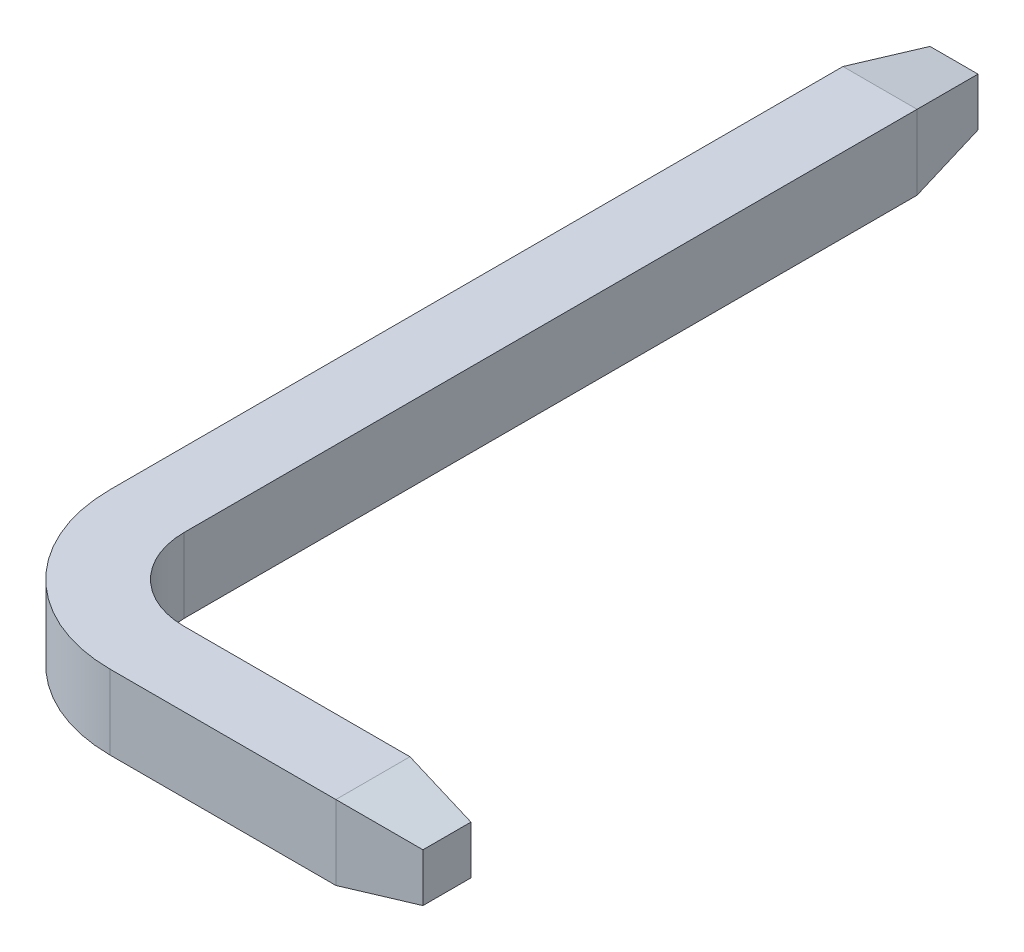
ISO-10303-21;
HEADER;
FILE_DESCRIPTION(('STEP AP214'),'2;1');
FILE_NAME('part.step','',(''),(''),'','','');
FILE_SCHEMA(('AUTOMOTIVE_DESIGN { 1 0 10303 214 1 1 1 1 }'));
ENDSEC;
DATA;
#1=APPLICATION_CONTEXT('core data for automotive mechanical design processes');
#2=APPLICATION_PROTOCOL_DEFINITION('international standard','automotive_design',2000,#1);
#3=PRODUCT_CONTEXT('',#1,'mechanical');
#4=PRODUCT('Part','Part','',(#3));
#5=PRODUCT_RELATED_PRODUCT_CATEGORY('part','',(#4));
#6=PRODUCT_DEFINITION_FORMATION('','',#4);
#7=PRODUCT_DEFINITION_CONTEXT('part definition',#1,'design');
#8=PRODUCT_DEFINITION('design','',#6,#7);
#9=PRODUCT_DEFINITION_SHAPE('','',#8);
#10=(LENGTH_UNIT() NAMED_UNIT(*) SI_UNIT(.MILLI.,.METRE.));
#11=(NAMED_UNIT(*) PLANE_ANGLE_UNIT() SI_UNIT($,.RADIAN.));
#12=(NAMED_UNIT(*) SI_UNIT($,.STERADIAN.) SOLID_ANGLE_UNIT());
#13=UNCERTAINTY_MEASURE_WITH_UNIT(LENGTH_MEASURE(1.E-05),#10,'distance_accuracy_value','');
#14=(GEOMETRIC_REPRESENTATION_CONTEXT(3) GLOBAL_UNCERTAINTY_ASSIGNED_CONTEXT((#13)) GLOBAL_UNIT_ASSIGNED_CONTEXT((#10,
#11,#12)) REPRESENTATION_CONTEXT('',''));
#15=CARTESIAN_POINT('',(0.,0.,0.));
#16=DIRECTION('',(0.,0.,1.));
#17=DIRECTION('',(1.,0.,0.));
#18=AXIS2_PLACEMENT_3D('',#15,#16,#17);
#19=CARTESIAN_POINT('',(2.503962305911,-0.163293740079,-3.516332606812));
#20=DIRECTION('',(-0.173648177667033,0.98480775301219,0.));
#21=DIRECTION('',(-0.98480775301219,-0.173648177667033,0.));
#22=AXIS2_PLACEMENT_3D('',#19,#20,#21);
#23=PLANE('',#22);
#24=DIRECTION('',(0.,0.,1.));
#25=VECTOR('',#24,1.);
#26=CARTESIAN_POINT('',(2.003962305911,-0.251457230434,-3.995294912723));
#27=LINE('',#26,#25);
#28=CARTESIAN_POINT('',(2.00396230591097,-0.251457230434,-2.94506871423417));
#29=VERTEX_POINT('',#28);
#30=CARTESIAN_POINT('',(2.00396230591097,-0.251457230434,-3.44552111121183));
#31=VERTEX_POINT('',#30);
#32=EDGE_CURVE('E135',#29,#31,#27,.F.);
#33=ORIENTED_EDGE('',*,*,#32,.T.);
#34=DIRECTION('',(-0.970287525247556,-0.171087869747438,-0.171087869746095));
#35=VECTOR('',#34,1.);
#36=CARTESIAN_POINT('',(2.503962305911,-0.163293740079,-3.357357620857));
#37=LINE('',#36,#35);
#38=CARTESIAN_POINT('',(2.503962305911,-0.163293740079,-3.357357620857));
#39=VERTEX_POINT('',#38);
#40=EDGE_CURVE('E196',#39,#31,#37,.T.);
#41=ORIENTED_EDGE('',*,*,#40,.F.);
#42=DIRECTION('',(0.,0.,1.));
#43=VECTOR('',#42,1.);
#44=CARTESIAN_POINT('',(2.503962305911,-0.163293740079,-3.516332606812));
#45=LINE('',#44,#43);
#46=CARTESIAN_POINT('',(2.503962305911,-0.163293740079,-3.033232204589));
#47=VERTEX_POINT('',#46);
#48=EDGE_CURVE('E177',#39,#47,#45,.T.);
#49=ORIENTED_EDGE('',*,*,#48,.T.);
#50=DIRECTION('',(0.970287525247556,0.171087869747438,-0.171087869746095));
#51=VECTOR('',#50,1.);
#52=CARTESIAN_POINT('',(2.00396230591088,-0.251457230434,-2.94506871423469));
#53=LINE('',#52,#51);
#54=EDGE_CURVE('E174',#29,#47,#53,.T.);
#55=ORIENTED_EDGE('',*,*,#54,.F.);
#56=EDGE_LOOP('',(#33,#41,#49,#55));
#57=FACE_BOUND('',#56,.T.);
#58=ADVANCED_FACE('F17',(#57),#23,.F.);
#59=CARTESIAN_POINT('',(-0.571263892578,-0.251457230434,-8.945294912723));
#60=DIRECTION('',(0.,-0.98480775301219,-0.173648177667033));
#61=DIRECTION('',(0.,0.173648177667033,-0.98480775301219));
#62=AXIS2_PLACEMENT_3D('',#59,#60,#61);
#63=PLANE('',#62);
#64=DIRECTION('',(-0.171087869746095,-0.171087869747438,0.970287525247556));
#65=VECTOR('',#64,1.);
#66=CARTESIAN_POINT('',(-0.483100402223692,-0.163293740079,-9.44529491272312));
#67=LINE('',#66,#65);
#68=CARTESIAN_POINT('',(-0.483100402223462,-0.163293740079,-9.44529491272308));
#69=VERTEX_POINT('',#68);
#70=CARTESIAN_POINT('',(-0.571263892578,-0.251457230434,-8.945294912723));
#71=VERTEX_POINT('',#70);
#72=EDGE_CURVE('E141',#69,#71,#67,.T.);
#73=ORIENTED_EDGE('',*,*,#72,.F.);
#74=DIRECTION('',(-1.,0.,0.));
#75=VECTOR('',#74,1.);
#76=CARTESIAN_POINT('',(0.,-0.163293740079,-9.445294912723));
#77=LINE('',#76,#75);
#78=CARTESIAN_POINT('',(-0.158974985954501,-0.163293740079,-9.44529491272294));
#79=VERTEX_POINT('',#78);
#80=EDGE_CURVE('E147',#79,#69,#77,.T.);
#81=ORIENTED_EDGE('',*,*,#80,.F.);
#82=DIRECTION('',(-0.171087869746093,0.171087869747508,-0.970287525247544));
#83=VECTOR('',#82,1.);
#84=CARTESIAN_POINT('',(-0.07081149560023,-0.251457230434,-8.945294912723));
#85=LINE('',#84,#83);
#86=CARTESIAN_POINT('',(-0.0708114956002305,-0.251457230434,-8.945294912723));
#87=VERTEX_POINT('',#86);
#88=EDGE_CURVE('E138',#87,#79,#85,.T.);
#89=ORIENTED_EDGE('',*,*,#88,.F.);
#90=DIRECTION('',(1.,0.,0.));
#91=VECTOR('',#90,1.);
#92=CARTESIAN_POINT('',(-0.571263892578,-0.251457230434,-8.945294912723));
#93=LINE('',#92,#91);
#94=EDGE_CURVE('E113',#87,#71,#93,.F.);
#95=ORIENTED_EDGE('',*,*,#94,.T.);
#96=EDGE_LOOP('',(#73,#81,#89,#95));
#97=FACE_BOUND('',#96,.T.);
#98=ADVANCED_FACE('F440',(#97),#63,.T.);
#99=CARTESIAN_POINT('',(2.503962305911,0.,-3.357357620857));
#100=DIRECTION('',(0.173648177667033,0.,-0.98480775301219));
#101=DIRECTION('',(-0.98480775301219,0.,-0.173648177667033));
#102=AXIS2_PLACEMENT_3D('',#99,#100,#101);
#103=PLANE('',#102);
#104=DIRECTION('',(0.970287525247556,-0.171087869746094,0.171087869747438));
#105=VECTOR('',#104,1.);
#106=CARTESIAN_POINT('',(2.00396230591088,0.251457230433308,-3.445521111212));
#107=LINE('',#106,#105);
#108=CARTESIAN_POINT('',(2.00396230591097,0.251457230433827,-3.445521111212));
#109=VERTEX_POINT('',#108);
#110=CARTESIAN_POINT('',(2.503962305911,0.163293740079,-3.357357620857));
#111=VERTEX_POINT('',#110);
#112=EDGE_CURVE('E190',#109,#111,#107,.T.);
#113=ORIENTED_EDGE('',*,*,#112,.T.);
#114=DIRECTION('',(0.,1.,0.));
#115=VECTOR('',#114,1.);
#116=CARTESIAN_POINT('',(2.503962305911,0.,-3.357357620857));
#117=LINE('',#116,#115);
#118=EDGE_CURVE('E193',#111,#39,#117,.F.);
#119=ORIENTED_EDGE('',*,*,#118,.T.);
#120=ORIENTED_EDGE('',*,*,#40,.T.);
#121=DIRECTION('',(0.,1.,0.));
#122=VECTOR('',#121,1.);
#123=CARTESIAN_POINT('',(2.003962305911,-0.251457230434,-3.445521111212));
#124=LINE('',#123,#122);
#125=EDGE_CURVE('E112',#109,#31,#124,.F.);
#126=ORIENTED_EDGE('',*,*,#125,.F.);
#127=EDGE_LOOP('',(#113,#119,#120,#126));
#128=FACE_BOUND('',#127,.T.);
#129=ADVANCED_FACE('F430',(#128),#103,.T.);
#130=CARTESIAN_POINT('',(2.503962305911,0.,-3.516332606812));
#131=DIRECTION('',(-1.,0.,0.));
#132=DIRECTION('',(0.,0.,1.));
#133=AXIS2_PLACEMENT_3D('',#130,#131,#132);
#134=PLANE('',#133);
#135=ORIENTED_EDGE('',*,*,#118,.F.);
#136=DIRECTION('',(0.,0.,1.));
#137=VECTOR('',#136,1.);
#138=CARTESIAN_POINT('',(2.503962305911,0.163293740079,-3.516332606812));
#139=LINE('',#138,#137);
#140=CARTESIAN_POINT('',(2.503962305911,0.163293740079001,-3.033232204589));
#141=VERTEX_POINT('',#140);
#142=EDGE_CURVE('E187',#111,#141,#139,.T.);
#143=ORIENTED_EDGE('',*,*,#142,.T.);
#144=DIRECTION('',(0.,1.,0.));
#145=VECTOR('',#144,1.);
#146=CARTESIAN_POINT('',(2.503962305911,0.,-3.033232204589));
#147=LINE('',#146,#145);
#148=EDGE_CURVE('E176',#47,#141,#147,.T.);
#149=ORIENTED_EDGE('',*,*,#148,.F.);
#150=ORIENTED_EDGE('',*,*,#48,.F.);
#151=EDGE_LOOP('',(#135,#143,#149,#150));
#152=FACE_BOUND('',#151,.T.);
#153=ADVANCED_FACE('F420',(#152),#134,.F.);
#154=CARTESIAN_POINT('',(2.503962305911,0.,-3.033232204589));
#155=DIRECTION('',(0.173648177667033,0.,0.98480775301219));
#156=DIRECTION('',(0.98480775301219,0.,-0.173648177667033));
#157=AXIS2_PLACEMENT_3D('',#154,#155,#156);
#158=PLANE('',#157);
#159=ORIENTED_EDGE('',*,*,#54,.T.);
#160=ORIENTED_EDGE('',*,*,#148,.T.);
#161=DIRECTION('',(-0.970287525247556,0.171087869746095,0.171087869747438));
#162=VECTOR('',#161,1.);
#163=CARTESIAN_POINT('',(2.503962305911,0.163293740079001,-3.033232204589));
#164=LINE('',#163,#162);
#165=CARTESIAN_POINT('',(2.00396230591097,0.251457230433827,-2.945068714234));
#166=VERTEX_POINT('',#165);
#167=EDGE_CURVE('E171',#141,#166,#164,.T.);
#168=ORIENTED_EDGE('',*,*,#167,.T.);
#169=DIRECTION('',(0.,1.,0.));
#170=VECTOR('',#169,1.);
#171=CARTESIAN_POINT('',(2.003962305911,-0.251457230434,-2.945068714234));
#172=LINE('',#171,#170);
#173=EDGE_CURVE('E170',#29,#166,#172,.T.);
#174=ORIENTED_EDGE('',*,*,#173,.F.);
#175=EDGE_LOOP('',(#159,#160,#168,#174));
#176=FACE_BOUND('',#175,.T.);
#177=ADVANCED_FACE('F410',(#176),#158,.T.);
#178=CARTESIAN_POINT('',(0.,0.,-9.445294912723));
#179=DIRECTION('',(0.,0.,-1.));
#180=DIRECTION('',(-1.,0.,0.));
#181=AXIS2_PLACEMENT_3D('',#178,#179,#180);
#182=PLANE('',#181);
#183=DIRECTION('',(1.,0.,0.));
#184=VECTOR('',#183,1.);
#185=CARTESIAN_POINT('',(-0.571263892578,0.163293740079692,-9.44529491272312));
#186=LINE('',#185,#184);
#187=CARTESIAN_POINT('',(-0.158974985954167,0.163293740079462,-9.44529491272305));
#188=VERTEX_POINT('',#187);
#189=CARTESIAN_POINT('',(-0.483100402223231,0.163293740079692,-9.44529491272312));
#190=VERTEX_POINT('',#189);
#191=EDGE_CURVE('E150',#188,#190,#186,.F.);
#192=ORIENTED_EDGE('',*,*,#191,.F.);
#193=DIRECTION('',(0.,1.,0.));
#194=VECTOR('',#193,1.);
#195=CARTESIAN_POINT('',(-0.158974985954501,-0.251457230434,-9.44529491272291));
#196=LINE('',#195,#194);
#197=EDGE_CURVE('E140',#79,#188,#196,.T.);
#198=ORIENTED_EDGE('',*,*,#197,.F.);
#199=ORIENTED_EDGE('',*,*,#80,.T.);
#200=DIRECTION('',(0.,1.,0.));
#201=VECTOR('',#200,1.);
#202=CARTESIAN_POINT('',(-0.483100402223692,-0.251457230434,-9.44529491272312));
#203=LINE('',#202,#201);
#204=EDGE_CURVE('E144',#190,#69,#203,.F.);
#205=ORIENTED_EDGE('',*,*,#204,.F.);
#206=EDGE_LOOP('',(#192,#198,#199,#205));
#207=FACE_BOUND('',#206,.T.);
#208=ADVANCED_FACE('F401',(#207),#182,.T.);
#209=CARTESIAN_POINT('',(-0.571263892578,-0.251457230434,-8.945294912723));
#210=DIRECTION('',(-0.98480775301219,0.,-0.173648177667033));
#211=DIRECTION('',(-0.173648177667033,0.,0.98480775301219));
#212=AXIS2_PLACEMENT_3D('',#209,#210,#211);
#213=PLANE('',#212);
#214=ORIENTED_EDGE('',*,*,#72,.T.);
#215=DIRECTION('',(0.,1.,0.));
#216=VECTOR('',#215,1.);
#217=CARTESIAN_POINT('',(-0.571263892578001,-0.251457230434,-8.945294912723));
#218=LINE('',#217,#216);
#219=CARTESIAN_POINT('',(-0.571263892578,0.251457230434,-8.945294912723));
#220=VERTEX_POINT('',#219);
#221=EDGE_CURVE('E163',#71,#220,#218,.T.);
#222=ORIENTED_EDGE('',*,*,#221,.T.);
#223=DIRECTION('',(-0.171087869747438,0.171087869746095,0.970287525247556));
#224=VECTOR('',#223,1.);
#225=CARTESIAN_POINT('',(-0.483100402223,0.163293740079692,-9.44529491272312));
#226=LINE('',#225,#224);
#227=EDGE_CURVE('E117',#190,#220,#226,.T.);
#228=ORIENTED_EDGE('',*,*,#227,.F.);
#229=ORIENTED_EDGE('',*,*,#204,.T.);
#230=EDGE_LOOP('',(#214,#222,#228,#229));
#231=FACE_BOUND('',#230,.T.);
#232=ADVANCED_FACE('F298',(#231),#213,.T.);
#233=CARTESIAN_POINT('',(-0.07081149560023,-0.251457230434,-8.945294912723));
#234=DIRECTION('',(0.98480775301219,0.,-0.173648177667033));
#235=DIRECTION('',(-0.173648177667033,0.,-0.98480775301219));
#236=AXIS2_PLACEMENT_3D('',#233,#234,#235);
#237=PLANE('',#236);
#238=DIRECTION('',(-0.171087869745121,-0.171087869746165,-0.970287525247952));
#239=VECTOR('',#238,1.);
#240=CARTESIAN_POINT('',(-0.0708114956002297,0.251457230434,-8.945294912723));
#241=LINE('',#240,#239);
#242=CARTESIAN_POINT('',(-0.0708114956002301,0.251457230434,-8.945294912723));
#243=VERTEX_POINT('',#242);
#244=EDGE_CURVE('E152',#243,#188,#241,.T.);
#245=ORIENTED_EDGE('',*,*,#244,.F.);
#246=DIRECTION('',(0.,1.,0.));
#247=VECTOR('',#246,1.);
#248=CARTESIAN_POINT('',(-0.0708114956002307,-0.251457230434,-8.945294912723));
#249=LINE('',#248,#247);
#250=EDGE_CURVE('E34',#243,#87,#249,.F.);
#251=ORIENTED_EDGE('',*,*,#250,.T.);
#252=ORIENTED_EDGE('',*,*,#88,.T.);
#253=ORIENTED_EDGE('',*,*,#197,.T.);
#254=EDGE_LOOP('',(#245,#251,#252,#253));
#255=FACE_BOUND('',#254,.T.);
#256=ADVANCED_FACE('F383',(#255),#237,.T.);
#257=CARTESIAN_POINT('',(-0.571263892578,-0.251457230434,-3.995294912723));
#258=DIRECTION('',(0.,1.,0.));
#259=DIRECTION('',(0.,0.,1.));
#260=AXIS2_PLACEMENT_3D('',#257,#258,#259);
#261=PLANE('',#260);
#262=ORIENTED_EDGE('',*,*,#94,.F.);
#263=DIRECTION('',(0.,0.,1.));
#264=VECTOR('',#263,1.);
#265=CARTESIAN_POINT('',(-0.07081149560023,-0.251457230434,-3.995294912723));
#266=LINE('',#265,#264);
#267=CARTESIAN_POINT('',(-0.07081149560023,-0.251457230434,-3.995294912723));
#268=VERTEX_POINT('',#267);
#269=EDGE_CURVE('E115',#87,#268,#266,.T.);
#270=ORIENTED_EDGE('',*,*,#269,.T.);
#271=CARTESIAN_POINT('',(0.478962305911,-0.251457230434,-3.995294912723));
#272=DIRECTION('',(0.,1.,0.));
#273=DIRECTION('',(0.,0.,1.));
#274=AXIS2_PLACEMENT_3D('',#271,#272,#273);
#275=CIRCLE('',#274,0.549773801511);
#276=CARTESIAN_POINT('',(0.478962305911,-0.251457230434,-3.445521111212));
#277=VERTEX_POINT('',#276);
#278=EDGE_CURVE('E20',#268,#277,#275,.T.);
#279=ORIENTED_EDGE('',*,*,#278,.T.);
#280=DIRECTION('',(-1.,0.,0.));
#281=VECTOR('',#280,1.);
#282=CARTESIAN_POINT('',(0.478962305911,-0.251457230434,-3.445521111212));
#283=LINE('',#282,#281);
#284=EDGE_CURVE('E199',#31,#277,#283,.T.);
#285=ORIENTED_EDGE('',*,*,#284,.F.);
#286=ORIENTED_EDGE('',*,*,#32,.F.);
#287=DIRECTION('',(1.,0.,0.));
#288=VECTOR('',#287,1.);
#289=CARTESIAN_POINT('',(0.478962305911,-0.251457230434,-2.945068714234));
#290=LINE('',#289,#288);
#291=CARTESIAN_POINT('',(0.478962305911,-0.251457230434,-2.945068714234));
#292=VERTEX_POINT('',#291);
#293=EDGE_CURVE('E167',#292,#29,#290,.T.);
#294=ORIENTED_EDGE('',*,*,#293,.F.);
#295=CARTESIAN_POINT('',(0.478962305911,-0.251457230434,-3.995294912723));
#296=DIRECTION('',(0.,1.,0.));
#297=DIRECTION('',(0.,0.,1.));
#298=AXIS2_PLACEMENT_3D('',#295,#296,#297);
#299=CIRCLE('',#298,1.050226198489);
#300=CARTESIAN_POINT('',(-0.571263892578,-0.251457230434,-3.995294912723));
#301=VERTEX_POINT('',#300);
#302=EDGE_CURVE('E218',#301,#292,#299,.T.);
#303=ORIENTED_EDGE('',*,*,#302,.F.);
#304=DIRECTION('',(0.,0.,-1.));
#305=VECTOR('',#304,1.);
#306=CARTESIAN_POINT('',(-0.571263892578,-0.251457230434,-3.995294912723));
#307=LINE('',#306,#305);
#308=EDGE_CURVE('E161',#301,#71,#307,.T.);
#309=ORIENTED_EDGE('',*,*,#308,.T.);
#310=EDGE_LOOP('',(#262,#270,#279,#285,#286,#294,#303,#309));
#311=FACE_BOUND('',#310,.T.);
#312=ADVANCED_FACE('F119',(#311),#261,.F.);
#313=CARTESIAN_POINT('',(0.478962305911,0.,-3.995294912723));
#314=DIRECTION('',(0.,1.,0.));
#315=DIRECTION('',(0.,0.,1.));
#316=AXIS2_PLACEMENT_3D('',#313,#314,#315);
#317=CYLINDRICAL_SURFACE('',#316,0.549773801511);
#318=CARTESIAN_POINT('',(0.478962305911,0.251457230434,-3.995294912723));
#319=DIRECTION('',(0.,1.,0.));
#320=DIRECTION('',(0.,0.,1.));
#321=AXIS2_PLACEMENT_3D('',#318,#319,#320);
#322=CIRCLE('',#321,0.549773801511);
#323=CARTESIAN_POINT('',(-0.07081149560023,0.251457230434,-3.995294912723));
#324=VERTEX_POINT('',#323);
#325=CARTESIAN_POINT('',(0.478962305911,0.251457230434,-3.445521111212));
#326=VERTEX_POINT('',#325);
#327=EDGE_CURVE('E123',#324,#326,#322,.T.);
#328=ORIENTED_EDGE('',*,*,#327,.T.);
#329=DIRECTION('',(0.,1.,0.));
#330=VECTOR('',#329,1.);
#331=CARTESIAN_POINT('',(0.478962305911,-0.251457230434,-3.445521111212));
#332=LINE('',#331,#330);
#333=EDGE_CURVE('E108',#277,#326,#332,.T.);
#334=ORIENTED_EDGE('',*,*,#333,.F.);
#335=ORIENTED_EDGE('',*,*,#278,.F.);
#336=DIRECTION('',(0.,1.,0.));
#337=VECTOR('',#336,1.);
#338=CARTESIAN_POINT('',(-0.07081149560023,-0.251457230434,-3.995294912723));
#339=LINE('',#338,#337);
#340=EDGE_CURVE('E107',#268,#324,#339,.T.);
#341=ORIENTED_EDGE('',*,*,#340,.T.);
#342=EDGE_LOOP('',(#328,#334,#335,#341));
#343=FACE_BOUND('',#342,.T.);
#344=ADVANCED_FACE('F106',(#343),#317,.F.);
#345=CARTESIAN_POINT('',(0.478962305911,-0.251457230434,-3.445521111212));
#346=DIRECTION('',(0.,0.,-1.));
#347=DIRECTION('',(-1.,0.,0.));
#348=AXIS2_PLACEMENT_3D('',#345,#346,#347);
#349=PLANE('',#348);
#350=ORIENTED_EDGE('',*,*,#284,.T.);
#351=ORIENTED_EDGE('',*,*,#333,.T.);
#352=DIRECTION('',(1.,0.,0.));
#353=VECTOR('',#352,1.);
#354=CARTESIAN_POINT('',(-0.571263892578,0.251457230434,-3.445521111212));
#355=LINE('',#354,#353);
#356=EDGE_CURVE('E125',#326,#109,#355,.T.);
#357=ORIENTED_EDGE('',*,*,#356,.T.);
#358=ORIENTED_EDGE('',*,*,#125,.T.);
#359=EDGE_LOOP('',(#350,#351,#357,#358));
#360=FACE_BOUND('',#359,.T.);
#361=ADVANCED_FACE('F249',(#360),#349,.T.);
#362=CARTESIAN_POINT('',(2.503962305911,0.163293740079,-3.516332606812));
#363=DIRECTION('',(-0.173648177667033,-0.98480775301219,0.));
#364=DIRECTION('',(0.98480775301219,-0.173648177667033,0.));
#365=AXIS2_PLACEMENT_3D('',#362,#363,#364);
#366=PLANE('',#365);
#367=ORIENTED_EDGE('',*,*,#142,.F.);
#368=ORIENTED_EDGE('',*,*,#112,.F.);
#369=DIRECTION('',(0.,0.,-1.));
#370=VECTOR('',#369,1.);
#371=CARTESIAN_POINT('',(2.003962305911,0.251457230434,-3.995294912723));
#372=LINE('',#371,#370);
#373=EDGE_CURVE('E233',#109,#166,#372,.F.);
#374=ORIENTED_EDGE('',*,*,#373,.T.);
#375=ORIENTED_EDGE('',*,*,#167,.F.);
#376=EDGE_LOOP('',(#367,#368,#374,#375));
#377=FACE_BOUND('',#376,.T.);
#378=ADVANCED_FACE('F349',(#377),#366,.F.);
#379=CARTESIAN_POINT('',(0.478962305911,-0.251457230434,-2.945068714234));
#380=DIRECTION('',(0.,0.,1.));
#381=DIRECTION('',(1.,0.,0.));
#382=AXIS2_PLACEMENT_3D('',#379,#380,#381);
#383=PLANE('',#382);
#384=DIRECTION('',(1.,0.,0.));
#385=VECTOR('',#384,1.);
#386=CARTESIAN_POINT('',(-0.571263892578,0.251457230434,-2.945068714234));
#387=LINE('',#386,#385);
#388=CARTESIAN_POINT('',(0.478962305911,0.251457230434,-2.945068714234));
#389=VERTEX_POINT('',#388);
#390=EDGE_CURVE('E217',#166,#389,#387,.F.);
#391=ORIENTED_EDGE('',*,*,#390,.T.);
#392=DIRECTION('',(0.,1.,0.));
#393=VECTOR('',#392,1.);
#394=CARTESIAN_POINT('',(0.478962305911,0.,-2.945068714234));
#395=LINE('',#394,#393);
#396=EDGE_CURVE('E219',#292,#389,#395,.T.);
#397=ORIENTED_EDGE('',*,*,#396,.F.);
#398=ORIENTED_EDGE('',*,*,#293,.T.);
#399=ORIENTED_EDGE('',*,*,#173,.T.);
#400=EDGE_LOOP('',(#391,#397,#398,#399));
#401=FACE_BOUND('',#400,.T.);
#402=ADVANCED_FACE('F257',(#401),#383,.T.);
#403=CARTESIAN_POINT('',(0.478962305911,0.,-3.995294912723));
#404=DIRECTION('',(0.,1.,0.));
#405=DIRECTION('',(0.,0.,1.));
#406=AXIS2_PLACEMENT_3D('',#403,#404,#405);
#407=CYLINDRICAL_SURFACE('',#406,1.050226198489);
#408=ORIENTED_EDGE('',*,*,#396,.T.);
#409=CARTESIAN_POINT('',(0.478962305911,0.251457230434,-3.995294912723));
#410=DIRECTION('',(0.,1.,0.));
#411=DIRECTION('',(0.,0.,1.));
#412=AXIS2_PLACEMENT_3D('',#409,#410,#411);
#413=CIRCLE('',#412,1.050226198489);
#414=CARTESIAN_POINT('',(-0.571263892578,0.251457230434,-3.995294912723));
#415=VERTEX_POINT('',#414);
#416=EDGE_CURVE('E214',#389,#415,#413,.F.);
#417=ORIENTED_EDGE('',*,*,#416,.T.);
#418=DIRECTION('',(0.,1.,0.));
#419=VECTOR('',#418,1.);
#420=CARTESIAN_POINT('',(-0.571263892578,-0.251457230434,-3.995294912723));
#421=LINE('',#420,#419);
#422=EDGE_CURVE('E164',#415,#301,#421,.F.);
#423=ORIENTED_EDGE('',*,*,#422,.T.);
#424=ORIENTED_EDGE('',*,*,#302,.T.);
#425=EDGE_LOOP('',(#408,#417,#423,#424));
#426=FACE_BOUND('',#425,.T.);
#427=ADVANCED_FACE('F260',(#426),#407,.T.);
#428=CARTESIAN_POINT('',(-0.571263892578,-0.251457230434,-3.995294912723));
#429=DIRECTION('',(1.,0.,0.));
#430=DIRECTION('',(0.,0.,-1.));
#431=AXIS2_PLACEMENT_3D('',#428,#429,#430);
#432=PLANE('',#431);
#433=ORIENTED_EDGE('',*,*,#221,.F.);
#434=ORIENTED_EDGE('',*,*,#308,.F.);
#435=ORIENTED_EDGE('',*,*,#422,.F.);
#436=DIRECTION('',(0.,0.,-1.));
#437=VECTOR('',#436,1.);
#438=CARTESIAN_POINT('',(-0.571263892578,0.251457230434,-3.995294912723));
#439=LINE('',#438,#437);
#440=EDGE_CURVE('E216',#415,#220,#439,.T.);
#441=ORIENTED_EDGE('',*,*,#440,.T.);
#442=EDGE_LOOP('',(#433,#434,#435,#441));
#443=FACE_BOUND('',#442,.T.);
#444=ADVANCED_FACE('F301',(#443),#432,.F.);
#445=CARTESIAN_POINT('',(-0.571263892578,0.251457230434,-8.945294912723));
#446=DIRECTION('',(0.,0.98480775301219,-0.173648177667033));
#447=DIRECTION('',(0.,0.173648177667033,0.98480775301219));
#448=AXIS2_PLACEMENT_3D('',#445,#446,#447);
#449=PLANE('',#448);
#450=ORIENTED_EDGE('',*,*,#227,.T.);
#451=DIRECTION('',(1.,0.,0.));
#452=VECTOR('',#451,1.);
#453=CARTESIAN_POINT('',(-0.571263892578,0.251457230434,-8.945294912723));
#454=LINE('',#453,#452);
#455=EDGE_CURVE('E26',#220,#243,#454,.T.);
#456=ORIENTED_EDGE('',*,*,#455,.T.);
#457=ORIENTED_EDGE('',*,*,#244,.T.);
#458=ORIENTED_EDGE('',*,*,#191,.T.);
#459=EDGE_LOOP('',(#450,#456,#457,#458));
#460=FACE_BOUND('',#459,.T.);
#461=ADVANCED_FACE('F303',(#460),#449,.T.);
#462=CARTESIAN_POINT('',(-0.07081149560023,-0.251457230434,-3.995294912723));
#463=DIRECTION('',(-1.,0.,0.));
#464=DIRECTION('',(0.,0.,1.));
#465=AXIS2_PLACEMENT_3D('',#462,#463,#464);
#466=PLANE('',#465);
#467=ORIENTED_EDGE('',*,*,#250,.F.);
#468=DIRECTION('',(0.,0.,-1.));
#469=VECTOR('',#468,1.);
#470=CARTESIAN_POINT('',(-0.07081149560023,0.251457230434,-3.995294912723));
#471=LINE('',#470,#469);
#472=EDGE_CURVE('E11',#243,#324,#471,.F.);
#473=ORIENTED_EDGE('',*,*,#472,.T.);
#474=ORIENTED_EDGE('',*,*,#340,.F.);
#475=ORIENTED_EDGE('',*,*,#269,.F.);
#476=EDGE_LOOP('',(#467,#473,#474,#475));
#477=FACE_BOUND('',#476,.T.);
#478=ADVANCED_FACE('F114',(#477),#466,.F.);
#479=CARTESIAN_POINT('',(-0.571263892578,0.251457230434,-3.995294912723));
#480=DIRECTION('',(0.,-1.,0.));
#481=DIRECTION('',(0.,0.,-1.));
#482=AXIS2_PLACEMENT_3D('',#479,#480,#481);
#483=PLANE('',#482);
#484=ORIENTED_EDGE('',*,*,#455,.F.);
#485=ORIENTED_EDGE('',*,*,#440,.F.);
#486=ORIENTED_EDGE('',*,*,#416,.F.);
#487=ORIENTED_EDGE('',*,*,#390,.F.);
#488=ORIENTED_EDGE('',*,*,#373,.F.);
#489=ORIENTED_EDGE('',*,*,#356,.F.);
#490=ORIENTED_EDGE('',*,*,#327,.F.);
#491=ORIENTED_EDGE('',*,*,#472,.F.);
#492=EDGE_LOOP('',(#484,#485,#486,#487,#488,#489,#490,#491));
#493=FACE_BOUND('',#492,.T.);
#494=ADVANCED_FACE('F264',(#493),#483,.F.);
#495=CLOSED_SHELL('',(#58,#98,#129,#153,#177,#208,#232,#256,#312,#344,#361,#378,#402,#427,#444,
#461,#478,#494));
#496=MANIFOLD_SOLID_BREP('B1',#495);
#497=ADVANCED_BREP_SHAPE_REPRESENTATION('',(#18,#496),#14);
#498=SHAPE_DEFINITION_REPRESENTATION(#9,#497);
ENDSEC;
END-ISO-10303-21;
